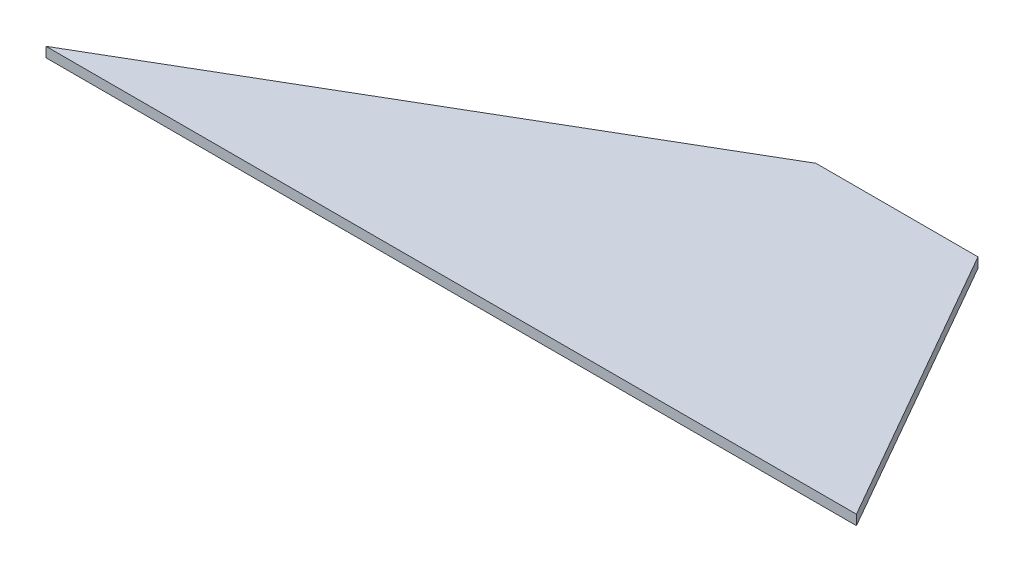
ISO-10303-21;
HEADER;
FILE_DESCRIPTION(('STEP AP214'),'2;1');
FILE_NAME('part.step','',(''),(''),'','','');
FILE_SCHEMA(('AUTOMOTIVE_DESIGN { 1 0 10303 214 1 1 1 1 }'));
ENDSEC;
DATA;
#1=APPLICATION_CONTEXT('core data for automotive mechanical design processes');
#2=APPLICATION_PROTOCOL_DEFINITION('international standard','automotive_design',2000,#1);
#3=PRODUCT_CONTEXT('',#1,'mechanical');
#4=PRODUCT('Part','Part','',(#3));
#5=PRODUCT_RELATED_PRODUCT_CATEGORY('part','',(#4));
#6=PRODUCT_DEFINITION_FORMATION('','',#4);
#7=PRODUCT_DEFINITION_CONTEXT('part definition',#1,'design');
#8=PRODUCT_DEFINITION('design','',#6,#7);
#9=PRODUCT_DEFINITION_SHAPE('','',#8);
#10=(LENGTH_UNIT() NAMED_UNIT(*) SI_UNIT(.MILLI.,.METRE.));
#11=(NAMED_UNIT(*) PLANE_ANGLE_UNIT() SI_UNIT($,.RADIAN.));
#12=(NAMED_UNIT(*) SI_UNIT($,.STERADIAN.) SOLID_ANGLE_UNIT());
#13=UNCERTAINTY_MEASURE_WITH_UNIT(LENGTH_MEASURE(1.E-05),#10,'distance_accuracy_value','');
#14=(GEOMETRIC_REPRESENTATION_CONTEXT(3) GLOBAL_UNCERTAINTY_ASSIGNED_CONTEXT((#13)) GLOBAL_UNIT_ASSIGNED_CONTEXT((#10,
#11,#12)) REPRESENTATION_CONTEXT('',''));
#15=CARTESIAN_POINT('',(0.,0.,0.));
#16=DIRECTION('',(0.,0.,1.));
#17=DIRECTION('',(1.,0.,0.));
#18=AXIS2_PLACEMENT_3D('',#15,#16,#17);
#19=CARTESIAN_POINT('',(152.4,3.1242,-88.9));
#20=DIRECTION('',(0.503871025524086,0.,0.863778900898433));
#21=DIRECTION('',(0.863778900898434,0.,-0.503871025524086));
#22=AXIS2_PLACEMENT_3D('',#19,#20,#21);
#23=PLANE('',#22);
#24=DIRECTION('',(-0.863778900898434,0.,0.503871025524086));
#25=VECTOR('',#24,1.);
#26=CARTESIAN_POINT('',(152.4,0.,-88.9));
#27=LINE('',#26,#25);
#28=CARTESIAN_POINT('',(152.4,0.,-88.9));
#29=VERTEX_POINT('',#28);
#30=CARTESIAN_POINT('',(0.,0.,0.));
#31=VERTEX_POINT('',#30);
#32=EDGE_CURVE('E96',#29,#31,#27,.T.);
#33=ORIENTED_EDGE('',*,*,#32,.T.);
#34=DIRECTION('',(0.,-1.,0.));
#35=VECTOR('',#34,1.);
#36=CARTESIAN_POINT('',(0.,3.1242,0.));
#37=LINE('',#36,#35);
#38=CARTESIAN_POINT('',(0.,3.1242,0.));
#39=VERTEX_POINT('',#38);
#40=EDGE_CURVE('E11',#39,#31,#37,.T.);
#41=ORIENTED_EDGE('',*,*,#40,.F.);
#42=DIRECTION('',(-0.863778900898434,0.,0.503871025524086));
#43=VECTOR('',#42,1.);
#44=CARTESIAN_POINT('',(152.4,3.1242,-88.9));
#45=LINE('',#44,#43);
#46=CARTESIAN_POINT('',(152.4,3.1242,-88.9));
#47=VERTEX_POINT('',#46);
#48=EDGE_CURVE('E84',#47,#39,#45,.T.);
#49=ORIENTED_EDGE('',*,*,#48,.F.);
#50=DIRECTION('',(0.,-1.,0.));
#51=VECTOR('',#50,1.);
#52=CARTESIAN_POINT('',(152.4,3.1242,-88.9));
#53=LINE('',#52,#51);
#54=EDGE_CURVE('E92',#47,#29,#53,.T.);
#55=ORIENTED_EDGE('',*,*,#54,.T.);
#56=EDGE_LOOP('',(#33,#41,#49,#55));
#57=FACE_BOUND('',#56,.T.);
#58=ADVANCED_FACE('F33',(#57),#23,.F.);
#59=CARTESIAN_POINT('',(0.,3.1242,0.));
#60=DIRECTION('',(0.,0.,-1.));
#61=DIRECTION('',(-1.,0.,0.));
#62=AXIS2_PLACEMENT_3D('',#59,#60,#61);
#63=PLANE('',#62);
#64=DIRECTION('',(1.,0.,0.));
#65=VECTOR('',#64,1.);
#66=CARTESIAN_POINT('',(0.,0.,0.));
#67=LINE('',#66,#65);
#68=CARTESIAN_POINT('',(254.,0.,0.));
#69=VERTEX_POINT('',#68);
#70=EDGE_CURVE('E88',#31,#69,#67,.T.);
#71=ORIENTED_EDGE('',*,*,#70,.T.);
#72=DIRECTION('',(0.,-1.,0.));
#73=VECTOR('',#72,1.);
#74=CARTESIAN_POINT('',(254.,3.1242,0.));
#75=LINE('',#74,#73);
#76=CARTESIAN_POINT('',(254.,3.1242,0.));
#77=VERTEX_POINT('',#76);
#78=EDGE_CURVE('E41',#77,#69,#75,.T.);
#79=ORIENTED_EDGE('',*,*,#78,.F.);
#80=DIRECTION('',(1.,0.,0.));
#81=VECTOR('',#80,1.);
#82=CARTESIAN_POINT('',(0.,3.1242,0.));
#83=LINE('',#82,#81);
#84=EDGE_CURVE('E79',#39,#77,#83,.T.);
#85=ORIENTED_EDGE('',*,*,#84,.F.);
#86=ORIENTED_EDGE('',*,*,#40,.T.);
#87=EDGE_LOOP('',(#71,#79,#85,#86));
#88=FACE_BOUND('',#87,.T.);
#89=ADVANCED_FACE('F87',(#88),#63,.F.);
#90=CARTESIAN_POINT('',(254.,3.1242,0.));
#91=DIRECTION('',(-0.868243142124459,0.,0.496138938356834));
#92=DIRECTION('',(0.496138938356834,0.,0.868243142124459));
#93=AXIS2_PLACEMENT_3D('',#90,#91,#92);
#94=PLANE('',#93);
#95=DIRECTION('',(-0.496138938356834,0.,-0.868243142124459));
#96=VECTOR('',#95,1.);
#97=CARTESIAN_POINT('',(254.,0.,0.));
#98=LINE('',#97,#96);
#99=CARTESIAN_POINT('',(203.2,0.,-88.9));
#100=VERTEX_POINT('',#99);
#101=EDGE_CURVE('E66',#69,#100,#98,.T.);
#102=ORIENTED_EDGE('',*,*,#101,.T.);
#103=DIRECTION('',(0.,-1.,0.));
#104=VECTOR('',#103,1.);
#105=CARTESIAN_POINT('',(203.2,3.1242,-88.9));
#106=LINE('',#105,#104);
#107=CARTESIAN_POINT('',(203.2,3.1242,-88.9));
#108=VERTEX_POINT('',#107);
#109=EDGE_CURVE('E89',#108,#100,#106,.T.);
#110=ORIENTED_EDGE('',*,*,#109,.F.);
#111=DIRECTION('',(-0.496138938356834,0.,-0.868243142124459));
#112=VECTOR('',#111,1.);
#113=CARTESIAN_POINT('',(254.,3.1242,0.));
#114=LINE('',#113,#112);
#115=EDGE_CURVE('E82',#77,#108,#114,.T.);
#116=ORIENTED_EDGE('',*,*,#115,.F.);
#117=ORIENTED_EDGE('',*,*,#78,.T.);
#118=EDGE_LOOP('',(#102,#110,#116,#117));
#119=FACE_BOUND('',#118,.T.);
#120=ADVANCED_FACE('F90',(#119),#94,.F.);
#121=CARTESIAN_POINT('',(203.2,3.1242,-88.9));
#122=DIRECTION('',(0.,0.,1.));
#123=DIRECTION('',(1.,0.,0.));
#124=AXIS2_PLACEMENT_3D('',#121,#122,#123);
#125=PLANE('',#124);
#126=DIRECTION('',(-1.,0.,0.));
#127=VECTOR('',#126,1.);
#128=CARTESIAN_POINT('',(203.2,0.,-88.9));
#129=LINE('',#128,#127);
#130=EDGE_CURVE('E72',#100,#29,#129,.T.);
#131=ORIENTED_EDGE('',*,*,#130,.T.);
#132=ORIENTED_EDGE('',*,*,#54,.F.);
#133=DIRECTION('',(-1.,0.,0.));
#134=VECTOR('',#133,1.);
#135=CARTESIAN_POINT('',(203.2,3.1242,-88.9));
#136=LINE('',#135,#134);
#137=EDGE_CURVE('E49',#108,#47,#136,.T.);
#138=ORIENTED_EDGE('',*,*,#137,.F.);
#139=ORIENTED_EDGE('',*,*,#109,.T.);
#140=EDGE_LOOP('',(#131,#132,#138,#139));
#141=FACE_BOUND('',#140,.T.);
#142=ADVANCED_FACE('F103',(#141),#125,.F.);
#143=CARTESIAN_POINT('',(0.,3.1242,0.));
#144=DIRECTION('',(0.,-1.,0.));
#145=DIRECTION('',(0.,0.,-1.));
#146=AXIS2_PLACEMENT_3D('',#143,#144,#145);
#147=PLANE('',#146);
#148=ORIENTED_EDGE('',*,*,#48,.T.);
#149=ORIENTED_EDGE('',*,*,#84,.T.);
#150=ORIENTED_EDGE('',*,*,#115,.T.);
#151=ORIENTED_EDGE('',*,*,#137,.T.);
#152=EDGE_LOOP('',(#148,#149,#150,#151));
#153=FACE_BOUND('',#152,.T.);
#154=ADVANCED_FACE('F80',(#153),#147,.F.);
#155=CARTESIAN_POINT('',(0.,0.,0.));
#156=DIRECTION('',(0.,-1.,0.));
#157=DIRECTION('',(0.,0.,-1.));
#158=AXIS2_PLACEMENT_3D('',#155,#156,#157);
#159=PLANE('',#158);
#160=ORIENTED_EDGE('',*,*,#32,.F.);
#161=ORIENTED_EDGE('',*,*,#130,.F.);
#162=ORIENTED_EDGE('',*,*,#101,.F.);
#163=ORIENTED_EDGE('',*,*,#70,.F.);
#164=EDGE_LOOP('',(#160,#161,#162,#163));
#165=FACE_BOUND('',#164,.T.);
#166=ADVANCED_FACE('F106',(#165),#159,.T.);
#167=CLOSED_SHELL('',(#58,#89,#120,#142,#154,#166));
#168=MANIFOLD_SOLID_BREP('B2',#167);
#169=ADVANCED_BREP_SHAPE_REPRESENTATION('',(#18,#168),#14);
#170=SHAPE_DEFINITION_REPRESENTATION(#9,#169);
ENDSEC;
END-ISO-10303-21;
